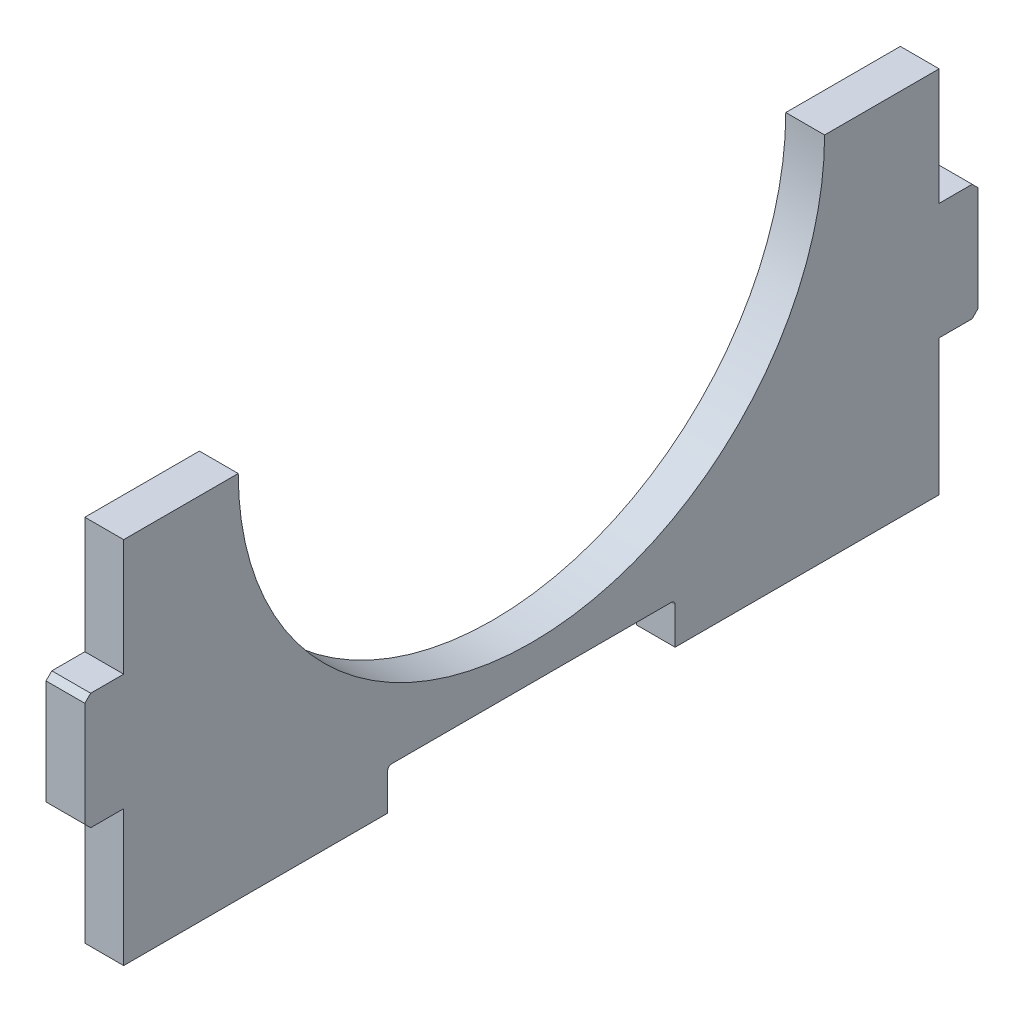
ISO-10303-21;
HEADER;
FILE_DESCRIPTION(('STEP AP214'),'2;1');
FILE_NAME('part.step','',(''),(''),'','','');
FILE_SCHEMA(('AUTOMOTIVE_DESIGN { 1 0 10303 214 1 1 1 1 }'));
ENDSEC;
DATA;
#1=APPLICATION_CONTEXT('core data for automotive mechanical design processes');
#2=APPLICATION_PROTOCOL_DEFINITION('international standard','automotive_design',2000,#1);
#3=PRODUCT_CONTEXT('',#1,'mechanical');
#4=PRODUCT('Part','Part','',(#3));
#5=PRODUCT_RELATED_PRODUCT_CATEGORY('part','',(#4));
#6=PRODUCT_DEFINITION_FORMATION('','',#4);
#7=PRODUCT_DEFINITION_CONTEXT('part definition',#1,'design');
#8=PRODUCT_DEFINITION('design','',#6,#7);
#9=PRODUCT_DEFINITION_SHAPE('','',#8);
#10=(LENGTH_UNIT() NAMED_UNIT(*) SI_UNIT(.MILLI.,.METRE.));
#11=(NAMED_UNIT(*) PLANE_ANGLE_UNIT() SI_UNIT($,.RADIAN.));
#12=(NAMED_UNIT(*) SI_UNIT($,.STERADIAN.) SOLID_ANGLE_UNIT());
#13=UNCERTAINTY_MEASURE_WITH_UNIT(LENGTH_MEASURE(1.E-05),#10,'distance_accuracy_value','');
#14=(GEOMETRIC_REPRESENTATION_CONTEXT(3) GLOBAL_UNCERTAINTY_ASSIGNED_CONTEXT((#13)) GLOBAL_UNIT_ASSIGNED_CONTEXT((#10,
#11,#12)) REPRESENTATION_CONTEXT('',''));
#15=CARTESIAN_POINT('',(0.,0.,0.));
#16=DIRECTION('',(0.,0.,1.));
#17=DIRECTION('',(1.,0.,0.));
#18=AXIS2_PLACEMENT_3D('',#15,#16,#17);
#19=CARTESIAN_POINT('',(5.,-95.,-105.));
#20=DIRECTION('',(0.,1.,0.));
#21=DIRECTION('',(0.,0.,1.));
#22=AXIS2_PLACEMENT_3D('',#19,#20,#21);
#23=PLANE('',#22);
#24=DIRECTION('',(0.,0.,-1.));
#25=VECTOR('',#24,1.);
#26=CARTESIAN_POINT('',(5.,-95.,-105.));
#27=LINE('',#26,#25);
#28=CARTESIAN_POINT('',(5.,-95.,-37.));
#29=VERTEX_POINT('',#28);
#30=CARTESIAN_POINT('',(5.,-95.,-105.));
#31=VERTEX_POINT('',#30);
#32=EDGE_CURVE('E229',#29,#31,#27,.T.);
#33=ORIENTED_EDGE('',*,*,#32,.F.);
#34=DIRECTION('',(1.,0.,0.));
#35=VECTOR('',#34,1.);
#36=CARTESIAN_POINT('',(-5.,-95.,-37.));
#37=LINE('',#36,#35);
#38=CARTESIAN_POINT('',(-5.,-95.,-37.));
#39=VERTEX_POINT('',#38);
#40=EDGE_CURVE('E221',#39,#29,#37,.T.);
#41=ORIENTED_EDGE('',*,*,#40,.F.);
#42=DIRECTION('',(0.,0.,-1.));
#43=VECTOR('',#42,1.);
#44=CARTESIAN_POINT('',(-5.,-95.,-105.));
#45=LINE('',#44,#43);
#46=CARTESIAN_POINT('',(-5.,-95.,-105.));
#47=VERTEX_POINT('',#46);
#48=EDGE_CURVE('E251',#39,#47,#45,.T.);
#49=ORIENTED_EDGE('',*,*,#48,.T.);
#50=DIRECTION('',(-1.,0.,0.));
#51=VECTOR('',#50,1.);
#52=CARTESIAN_POINT('',(5.,-95.,-105.));
#53=LINE('',#52,#51);
#54=EDGE_CURVE('E265',#31,#47,#53,.T.);
#55=ORIENTED_EDGE('',*,*,#54,.F.);
#56=EDGE_LOOP('',(#33,#41,#49,#55));
#57=FACE_BOUND('',#56,.T.);
#58=ADVANCED_FACE('F41',(#57),#23,.F.);
#59=CARTESIAN_POINT('',(5.,0.,-105.));
#60=DIRECTION('',(0.,0.,1.));
#61=DIRECTION('',(1.,0.,0.));
#62=AXIS2_PLACEMENT_3D('',#59,#60,#61);
#63=PLANE('',#62);
#64=DIRECTION('',(-1.,0.,0.));
#65=VECTOR('',#64,1.);
#66=CARTESIAN_POINT('',(5.,-60.,-105.));
#67=LINE('',#66,#65);
#68=CARTESIAN_POINT('',(5.,-60.,-105.));
#69=VERTEX_POINT('',#68);
#70=CARTESIAN_POINT('',(-5.,-60.,-105.));
#71=VERTEX_POINT('',#70);
#72=EDGE_CURVE('E362',#69,#71,#67,.T.);
#73=ORIENTED_EDGE('',*,*,#72,.F.);
#74=DIRECTION('',(0.,1.,0.));
#75=VECTOR('',#74,1.);
#76=CARTESIAN_POINT('',(5.,0.,-105.));
#77=LINE('',#76,#75);
#78=EDGE_CURVE('E231',#31,#69,#77,.T.);
#79=ORIENTED_EDGE('',*,*,#78,.F.);
#80=ORIENTED_EDGE('',*,*,#54,.T.);
#81=DIRECTION('',(0.,1.,0.));
#82=VECTOR('',#81,1.);
#83=CARTESIAN_POINT('',(-5.,0.,-105.));
#84=LINE('',#83,#82);
#85=EDGE_CURVE('E254',#47,#71,#84,.T.);
#86=ORIENTED_EDGE('',*,*,#85,.T.);
#87=EDGE_LOOP('',(#73,#79,#80,#86));
#88=FACE_BOUND('',#87,.T.);
#89=ADVANCED_FACE('F461',(#88),#63,.F.);
#90=CARTESIAN_POINT('',(5.,-95.,105.));
#91=DIRECTION('',(0.,0.,-1.));
#92=DIRECTION('',(-1.,0.,0.));
#93=AXIS2_PLACEMENT_3D('',#90,#91,#92);
#94=PLANE('',#93);
#95=DIRECTION('',(-1.,0.,0.));
#96=VECTOR('',#95,1.);
#97=CARTESIAN_POINT('',(5.,-30.,105.));
#98=LINE('',#97,#96);
#99=CARTESIAN_POINT('',(5.,-30.,105.));
#100=VERTEX_POINT('',#99);
#101=CARTESIAN_POINT('',(-5.,-30.,105.));
#102=VERTEX_POINT('',#101);
#103=EDGE_CURVE('E245',#100,#102,#98,.T.);
#104=ORIENTED_EDGE('',*,*,#103,.F.);
#105=DIRECTION('',(0.,-1.,0.));
#106=VECTOR('',#105,1.);
#107=CARTESIAN_POINT('',(5.,-95.,105.));
#108=LINE('',#107,#106);
#109=CARTESIAN_POINT('',(5.,0.,105.));
#110=VERTEX_POINT('',#109);
#111=EDGE_CURVE('E233',#110,#100,#108,.T.);
#112=ORIENTED_EDGE('',*,*,#111,.F.);
#113=DIRECTION('',(-1.,0.,0.));
#114=VECTOR('',#113,1.);
#115=CARTESIAN_POINT('',(5.,0.,105.));
#116=LINE('',#115,#114);
#117=CARTESIAN_POINT('',(-5.,0.,105.));
#118=VERTEX_POINT('',#117);
#119=EDGE_CURVE('E270',#110,#118,#116,.T.);
#120=ORIENTED_EDGE('',*,*,#119,.T.);
#121=DIRECTION('',(0.,-1.,0.));
#122=VECTOR('',#121,1.);
#123=CARTESIAN_POINT('',(-5.,-95.,105.));
#124=LINE('',#123,#122);
#125=EDGE_CURVE('E248',#118,#102,#124,.T.);
#126=ORIENTED_EDGE('',*,*,#125,.T.);
#127=EDGE_LOOP('',(#104,#112,#120,#126));
#128=FACE_BOUND('',#127,.T.);
#129=ADVANCED_FACE('F394',(#128),#94,.F.);
#130=CARTESIAN_POINT('',(5.,0.,0.));
#131=DIRECTION('',(-1.,0.,0.));
#132=DIRECTION('',(0.,0.,1.));
#133=AXIS2_PLACEMENT_3D('',#130,#131,#132);
#134=CYLINDRICAL_SURFACE('',#133,75.5);
#135=CARTESIAN_POINT('',(-5.,0.,0.));
#136=DIRECTION('',(-1.,0.,0.));
#137=DIRECTION('',(0.,0.,1.));
#138=AXIS2_PLACEMENT_3D('',#135,#136,#137);
#139=CIRCLE('',#138,75.5);
#140=CARTESIAN_POINT('',(-5.,0.,-75.5));
#141=VERTEX_POINT('',#140);
#142=CARTESIAN_POINT('',(-5.,0.,75.5));
#143=VERTEX_POINT('',#142);
#144=EDGE_CURVE('E241',#141,#143,#139,.T.);
#145=ORIENTED_EDGE('',*,*,#144,.T.);
#146=DIRECTION('',(-1.,0.,0.));
#147=VECTOR('',#146,1.);
#148=CARTESIAN_POINT('',(5.,0.,75.5));
#149=LINE('',#148,#147);
#150=CARTESIAN_POINT('',(5.,0.,75.5));
#151=VERTEX_POINT('',#150);
#152=EDGE_CURVE('E273',#151,#143,#149,.T.);
#153=ORIENTED_EDGE('',*,*,#152,.F.);
#154=CARTESIAN_POINT('',(5.,0.,0.));
#155=DIRECTION('',(-1.,0.,0.));
#156=DIRECTION('',(0.,0.,1.));
#157=AXIS2_PLACEMENT_3D('',#154,#155,#156);
#158=CIRCLE('',#157,75.5);
#159=CARTESIAN_POINT('',(5.,0.,-75.5));
#160=VERTEX_POINT('',#159);
#161=EDGE_CURVE('E259',#160,#151,#158,.T.);
#162=ORIENTED_EDGE('',*,*,#161,.F.);
#163=DIRECTION('',(-1.,0.,0.));
#164=VECTOR('',#163,1.);
#165=CARTESIAN_POINT('',(5.,0.,-75.5));
#166=LINE('',#165,#164);
#167=EDGE_CURVE('E240',#160,#141,#166,.T.);
#168=ORIENTED_EDGE('',*,*,#167,.T.);
#169=EDGE_LOOP('',(#145,#153,#162,#168));
#170=FACE_BOUND('',#169,.T.);
#171=ADVANCED_FACE('F426',(#170),#134,.F.);
#172=CARTESIAN_POINT('',(5.,0.,105.));
#173=DIRECTION('',(0.,-1.,0.));
#174=DIRECTION('',(0.,0.,-1.));
#175=AXIS2_PLACEMENT_3D('',#172,#173,#174);
#176=PLANE('',#175);
#177=DIRECTION('',(0.,0.,1.));
#178=VECTOR('',#177,1.);
#179=CARTESIAN_POINT('',(-5.,0.,105.));
#180=LINE('',#179,#178);
#181=EDGE_CURVE('E244',#143,#118,#180,.T.);
#182=ORIENTED_EDGE('',*,*,#181,.T.);
#183=ORIENTED_EDGE('',*,*,#119,.F.);
#184=DIRECTION('',(0.,0.,1.));
#185=VECTOR('',#184,1.);
#186=CARTESIAN_POINT('',(5.,0.,105.));
#187=LINE('',#186,#185);
#188=EDGE_CURVE('E387',#151,#110,#187,.T.);
#189=ORIENTED_EDGE('',*,*,#188,.F.);
#190=ORIENTED_EDGE('',*,*,#152,.T.);
#191=EDGE_LOOP('',(#182,#183,#189,#190));
#192=FACE_BOUND('',#191,.T.);
#193=ADVANCED_FACE('F423',(#192),#176,.F.);
#194=CARTESIAN_POINT('',(5.,-60.,105.));
#195=VERTEX_POINT('',#194);
#196=CARTESIAN_POINT('',(5.,-95.,105.));
#197=VERTEX_POINT('',#196);
#198=EDGE_CURVE('E226',#195,#197,#108,.T.);
#199=ORIENTED_EDGE('',*,*,#198,.F.);
#200=DIRECTION('',(-1.,0.,0.));
#201=VECTOR('',#200,1.);
#202=CARTESIAN_POINT('',(5.,-60.,105.));
#203=LINE('',#202,#201);
#204=CARTESIAN_POINT('',(-5.,-60.,105.));
#205=VERTEX_POINT('',#204);
#206=EDGE_CURVE('E375',#195,#205,#203,.T.);
#207=ORIENTED_EDGE('',*,*,#206,.T.);
#208=CARTESIAN_POINT('',(-5.,-95.,105.));
#209=VERTEX_POINT('',#208);
#210=EDGE_CURVE('E247',#205,#209,#124,.T.);
#211=ORIENTED_EDGE('',*,*,#210,.T.);
#212=DIRECTION('',(-1.,0.,0.));
#213=VECTOR('',#212,1.);
#214=CARTESIAN_POINT('',(5.,-95.,105.));
#215=LINE('',#214,#213);
#216=EDGE_CURVE('E268',#197,#209,#215,.T.);
#217=ORIENTED_EDGE('',*,*,#216,.F.);
#218=EDGE_LOOP('',(#199,#207,#211,#217));
#219=FACE_BOUND('',#218,.T.);
#220=ADVANCED_FACE('F418',(#219),#94,.F.);
#221=CARTESIAN_POINT('',(-5.,-95.,37.));
#222=VERTEX_POINT('',#221);
#223=EDGE_CURVE('E220',#209,#222,#45,.T.);
#224=ORIENTED_EDGE('',*,*,#223,.T.);
#225=DIRECTION('',(1.,0.,0.));
#226=VECTOR('',#225,1.);
#227=CARTESIAN_POINT('',(-5.,-95.,37.));
#228=LINE('',#227,#226);
#229=CARTESIAN_POINT('',(5.,-95.,37.));
#230=VERTEX_POINT('',#229);
#231=EDGE_CURVE('E206',#222,#230,#228,.T.);
#232=ORIENTED_EDGE('',*,*,#231,.T.);
#233=EDGE_CURVE('E218',#197,#230,#27,.T.);
#234=ORIENTED_EDGE('',*,*,#233,.F.);
#235=ORIENTED_EDGE('',*,*,#216,.T.);
#236=EDGE_LOOP('',(#224,#232,#234,#235));
#237=FACE_BOUND('',#236,.T.);
#238=ADVANCED_FACE('F216',(#237),#23,.F.);
#239=CARTESIAN_POINT('',(5.,-30.,-105.));
#240=VERTEX_POINT('',#239);
#241=CARTESIAN_POINT('',(5.,0.,-105.));
#242=VERTEX_POINT('',#241);
#243=EDGE_CURVE('E228',#240,#242,#77,.T.);
#244=ORIENTED_EDGE('',*,*,#243,.F.);
#245=DIRECTION('',(-1.,0.,0.));
#246=VECTOR('',#245,1.);
#247=CARTESIAN_POINT('',(5.,-30.,-105.));
#248=LINE('',#247,#246);
#249=CARTESIAN_POINT('',(-5.,-30.,-105.));
#250=VERTEX_POINT('',#249);
#251=EDGE_CURVE('E353',#240,#250,#248,.T.);
#252=ORIENTED_EDGE('',*,*,#251,.T.);
#253=CARTESIAN_POINT('',(-5.,0.,-105.));
#254=VERTEX_POINT('',#253);
#255=EDGE_CURVE('E253',#250,#254,#84,.T.);
#256=ORIENTED_EDGE('',*,*,#255,.T.);
#257=DIRECTION('',(-1.,0.,0.));
#258=VECTOR('',#257,1.);
#259=CARTESIAN_POINT('',(5.,0.,-105.));
#260=LINE('',#259,#258);
#261=EDGE_CURVE('E262',#242,#254,#260,.T.);
#262=ORIENTED_EDGE('',*,*,#261,.F.);
#263=EDGE_LOOP('',(#244,#252,#256,#262));
#264=FACE_BOUND('',#263,.T.);
#265=ADVANCED_FACE('F435',(#264),#63,.F.);
#266=CARTESIAN_POINT('',(5.,0.,-75.5));
#267=DIRECTION('',(0.,-1.,0.));
#268=DIRECTION('',(0.,0.,-1.));
#269=AXIS2_PLACEMENT_3D('',#266,#267,#268);
#270=PLANE('',#269);
#271=DIRECTION('',(0.,0.,1.));
#272=VECTOR('',#271,1.);
#273=CARTESIAN_POINT('',(-5.,0.,-75.5));
#274=LINE('',#273,#272);
#275=EDGE_CURVE('E257',#254,#141,#274,.T.);
#276=ORIENTED_EDGE('',*,*,#275,.T.);
#277=ORIENTED_EDGE('',*,*,#167,.F.);
#278=DIRECTION('',(0.,0.,1.));
#279=VECTOR('',#278,1.);
#280=CARTESIAN_POINT('',(5.,0.,-75.5));
#281=LINE('',#280,#279);
#282=EDGE_CURVE('E238',#242,#160,#281,.T.);
#283=ORIENTED_EDGE('',*,*,#282,.F.);
#284=ORIENTED_EDGE('',*,*,#261,.T.);
#285=EDGE_LOOP('',(#276,#277,#283,#284));
#286=FACE_BOUND('',#285,.T.);
#287=ADVANCED_FACE('F430',(#286),#270,.F.);
#288=CARTESIAN_POINT('',(5.,0.,0.));
#289=DIRECTION('',(-1.,0.,0.));
#290=DIRECTION('',(0.,0.,1.));
#291=AXIS2_PLACEMENT_3D('',#288,#289,#290);
#292=PLANE('',#291);
#293=DIRECTION('',(0.,0.,1.));
#294=VECTOR('',#293,1.);
#295=CARTESIAN_POINT('',(5.,-84.5,37.));
#296=LINE('',#295,#294);
#297=CARTESIAN_POINT('',(5.,-84.5,-36.));
#298=VERTEX_POINT('',#297);
#299=CARTESIAN_POINT('',(5.,-84.5,36.));
#300=VERTEX_POINT('',#299);
#301=EDGE_CURVE('E212',#298,#300,#296,.T.);
#302=ORIENTED_EDGE('',*,*,#301,.F.);
#303=CARTESIAN_POINT('',(5.,-85.5,-36.));
#304=DIRECTION('',(-1.,0.,0.));
#305=DIRECTION('',(0.,0.,1.));
#306=AXIS2_PLACEMENT_3D('',#303,#304,#305);
#307=CIRCLE('',#306,1.);
#308=CARTESIAN_POINT('',(5.,-85.5,-37.));
#309=VERTEX_POINT('',#308);
#310=EDGE_CURVE('E49',#298,#309,#307,.T.);
#311=ORIENTED_EDGE('',*,*,#310,.T.);
#312=DIRECTION('',(0.,1.,0.));
#313=VECTOR('',#312,1.);
#314=CARTESIAN_POINT('',(5.,-84.5,-37.));
#315=LINE('',#314,#313);
#316=EDGE_CURVE('E336',#29,#309,#315,.T.);
#317=ORIENTED_EDGE('',*,*,#316,.F.);
#318=ORIENTED_EDGE('',*,*,#32,.T.);
#319=ORIENTED_EDGE('',*,*,#78,.T.);
#320=DIRECTION('',(0.,0.,1.));
#321=VECTOR('',#320,1.);
#322=CARTESIAN_POINT('',(5.,-60.,-105.));
#323=LINE('',#322,#321);
#324=CARTESIAN_POINT('',(5.,-60.,-113.5));
#325=VERTEX_POINT('',#324);
#326=EDGE_CURVE('E344',#325,#69,#323,.T.);
#327=ORIENTED_EDGE('',*,*,#326,.F.);
#328=DIRECTION('',(0.,-0.707106781186548,0.707106781186548));
#329=VECTOR('',#328,1.);
#330=CARTESIAN_POINT('',(5.,-58.5,-115.));
#331=LINE('',#330,#329);
#332=CARTESIAN_POINT('',(5.,-58.5,-115.));
#333=VERTEX_POINT('',#332);
#334=EDGE_CURVE('E306',#325,#333,#331,.F.);
#335=ORIENTED_EDGE('',*,*,#334,.T.);
#336=DIRECTION('',(0.,-1.,0.));
#337=VECTOR('',#336,1.);
#338=CARTESIAN_POINT('',(5.,-60.,-115.));
#339=LINE('',#338,#337);
#340=CARTESIAN_POINT('',(5.,-31.5,-115.));
#341=VERTEX_POINT('',#340);
#342=EDGE_CURVE('E346',#341,#333,#339,.T.);
#343=ORIENTED_EDGE('',*,*,#342,.F.);
#344=DIRECTION('',(0.,-0.707106781186548,-0.707106781186548));
#345=VECTOR('',#344,1.);
#346=CARTESIAN_POINT('',(5.,-30.,-113.5));
#347=LINE('',#346,#345);
#348=CARTESIAN_POINT('',(5.,-30.,-113.5));
#349=VERTEX_POINT('',#348);
#350=EDGE_CURVE('E308',#341,#349,#347,.F.);
#351=ORIENTED_EDGE('',*,*,#350,.T.);
#352=DIRECTION('',(0.,0.,-1.));
#353=VECTOR('',#352,1.);
#354=CARTESIAN_POINT('',(5.,-30.,-115.));
#355=LINE('',#354,#353);
#356=EDGE_CURVE('E350',#240,#349,#355,.T.);
#357=ORIENTED_EDGE('',*,*,#356,.F.);
#358=ORIENTED_EDGE('',*,*,#243,.T.);
#359=ORIENTED_EDGE('',*,*,#282,.T.);
#360=ORIENTED_EDGE('',*,*,#161,.T.);
#361=ORIENTED_EDGE('',*,*,#188,.T.);
#362=ORIENTED_EDGE('',*,*,#111,.T.);
#363=DIRECTION('',(0.,0.,1.));
#364=VECTOR('',#363,1.);
#365=CARTESIAN_POINT('',(5.,-30.,115.));
#366=LINE('',#365,#364);
#367=CARTESIAN_POINT('',(5.,-30.,113.5));
#368=VERTEX_POINT('',#367);
#369=EDGE_CURVE('E366',#100,#368,#366,.T.);
#370=ORIENTED_EDGE('',*,*,#369,.T.);
#371=DIRECTION('',(0.,0.707106781186548,-0.707106781186548));
#372=VECTOR('',#371,1.);
#373=CARTESIAN_POINT('',(5.,-31.5,115.));
#374=LINE('',#373,#372);
#375=CARTESIAN_POINT('',(5.,-31.5,115.));
#376=VERTEX_POINT('',#375);
#377=EDGE_CURVE('E289',#368,#376,#374,.F.);
#378=ORIENTED_EDGE('',*,*,#377,.T.);
#379=DIRECTION('',(0.,-1.,0.));
#380=VECTOR('',#379,1.);
#381=CARTESIAN_POINT('',(5.,-60.,115.));
#382=LINE('',#381,#380);
#383=CARTESIAN_POINT('',(5.,-58.5,115.));
#384=VERTEX_POINT('',#383);
#385=EDGE_CURVE('E369',#376,#384,#382,.T.);
#386=ORIENTED_EDGE('',*,*,#385,.T.);
#387=DIRECTION('',(0.,0.707106781186548,0.707106781186548));
#388=VECTOR('',#387,1.);
#389=CARTESIAN_POINT('',(5.,-60.,113.5));
#390=LINE('',#389,#388);
#391=CARTESIAN_POINT('',(5.,-60.,113.5));
#392=VERTEX_POINT('',#391);
#393=EDGE_CURVE('E287',#384,#392,#390,.F.);
#394=ORIENTED_EDGE('',*,*,#393,.T.);
#395=DIRECTION('',(0.,0.,-1.));
#396=VECTOR('',#395,1.);
#397=CARTESIAN_POINT('',(5.,-60.,105.));
#398=LINE('',#397,#396);
#399=EDGE_CURVE('E373',#392,#195,#398,.T.);
#400=ORIENTED_EDGE('',*,*,#399,.T.);
#401=ORIENTED_EDGE('',*,*,#198,.T.);
#402=ORIENTED_EDGE('',*,*,#233,.T.);
#403=DIRECTION('',(0.,-1.,0.));
#404=VECTOR('',#403,1.);
#405=CARTESIAN_POINT('',(5.,-95.,37.));
#406=LINE('',#405,#404);
#407=CARTESIAN_POINT('',(5.,-85.5,37.));
#408=VERTEX_POINT('',#407);
#409=EDGE_CURVE('E202',#408,#230,#406,.T.);
#410=ORIENTED_EDGE('',*,*,#409,.F.);
#411=CARTESIAN_POINT('',(5.,-85.5,36.));
#412=DIRECTION('',(-1.,0.,0.));
#413=DIRECTION('',(0.,0.,1.));
#414=AXIS2_PLACEMENT_3D('',#411,#412,#413);
#415=CIRCLE('',#414,1.);
#416=EDGE_CURVE('E319',#408,#300,#415,.T.);
#417=ORIENTED_EDGE('',*,*,#416,.T.);
#418=EDGE_LOOP('',(#302,#311,#317,#318,#319,#327,#335,#343,#351,#357,#358,#359,#360,#361,#362,
#370,#378,#386,#394,#400,#401,#402,#410,#417));
#419=FACE_BOUND('',#418,.T.);
#420=ADVANCED_FACE('F224',(#419),#292,.F.);
#421=CARTESIAN_POINT('',(-5.,0.,0.));
#422=DIRECTION('',(-1.,0.,0.));
#423=DIRECTION('',(0.,0.,1.));
#424=AXIS2_PLACEMENT_3D('',#421,#422,#423);
#425=PLANE('',#424);
#426=DIRECTION('',(0.,1.,0.));
#427=VECTOR('',#426,1.);
#428=CARTESIAN_POINT('',(-5.,-84.5,-37.));
#429=LINE('',#428,#427);
#430=CARTESIAN_POINT('',(-5.,-85.5,-37.));
#431=VERTEX_POINT('',#430);
#432=EDGE_CURVE('E211',#39,#431,#429,.T.);
#433=ORIENTED_EDGE('',*,*,#432,.T.);
#434=CARTESIAN_POINT('',(-5.,-85.5,-36.));
#435=DIRECTION('',(-1.,0.,0.));
#436=DIRECTION('',(0.,0.,1.));
#437=AXIS2_PLACEMENT_3D('',#434,#435,#436);
#438=CIRCLE('',#437,1.);
#439=CARTESIAN_POINT('',(-5.,-84.5,-36.));
#440=VERTEX_POINT('',#439);
#441=EDGE_CURVE('E11',#431,#440,#438,.F.);
#442=ORIENTED_EDGE('',*,*,#441,.T.);
#443=DIRECTION('',(0.,0.,1.));
#444=VECTOR('',#443,1.);
#445=CARTESIAN_POINT('',(-5.,-84.5,37.));
#446=LINE('',#445,#444);
#447=CARTESIAN_POINT('',(-5.,-84.5,36.));
#448=VERTEX_POINT('',#447);
#449=EDGE_CURVE('E327',#440,#448,#446,.T.);
#450=ORIENTED_EDGE('',*,*,#449,.T.);
#451=CARTESIAN_POINT('',(-5.,-85.5,36.));
#452=DIRECTION('',(-1.,0.,0.));
#453=DIRECTION('',(0.,0.,1.));
#454=AXIS2_PLACEMENT_3D('',#451,#452,#453);
#455=CIRCLE('',#454,1.);
#456=CARTESIAN_POINT('',(-5.,-85.5,37.));
#457=VERTEX_POINT('',#456);
#458=EDGE_CURVE('E321',#448,#457,#455,.F.);
#459=ORIENTED_EDGE('',*,*,#458,.T.);
#460=DIRECTION('',(0.,-1.,0.));
#461=VECTOR('',#460,1.);
#462=CARTESIAN_POINT('',(-5.,-95.,37.));
#463=LINE('',#462,#461);
#464=EDGE_CURVE('E222',#457,#222,#463,.T.);
#465=ORIENTED_EDGE('',*,*,#464,.T.);
#466=ORIENTED_EDGE('',*,*,#223,.F.);
#467=ORIENTED_EDGE('',*,*,#210,.F.);
#468=DIRECTION('',(0.,0.,-1.));
#469=VECTOR('',#468,1.);
#470=CARTESIAN_POINT('',(-5.,-60.,105.));
#471=LINE('',#470,#469);
#472=CARTESIAN_POINT('',(-5.,-60.,113.5));
#473=VERTEX_POINT('',#472);
#474=EDGE_CURVE('E370',#473,#205,#471,.T.);
#475=ORIENTED_EDGE('',*,*,#474,.F.);
#476=DIRECTION('',(0.,-0.707106781186548,-0.707106781186548));
#477=VECTOR('',#476,1.);
#478=CARTESIAN_POINT('',(-5.,-86.75,86.75));
#479=LINE('',#478,#477);
#480=CARTESIAN_POINT('',(-5.,-58.5,115.));
#481=VERTEX_POINT('',#480);
#482=EDGE_CURVE('E281',#473,#481,#479,.F.);
#483=ORIENTED_EDGE('',*,*,#482,.T.);
#484=DIRECTION('',(0.,-1.,0.));
#485=VECTOR('',#484,1.);
#486=CARTESIAN_POINT('',(-5.,-60.,115.));
#487=LINE('',#486,#485);
#488=CARTESIAN_POINT('',(-5.,-31.5,115.));
#489=VERTEX_POINT('',#488);
#490=EDGE_CURVE('E378',#489,#481,#487,.T.);
#491=ORIENTED_EDGE('',*,*,#490,.F.);
#492=DIRECTION('',(0.,-0.707106781186548,0.707106781186548));
#493=VECTOR('',#492,1.);
#494=CARTESIAN_POINT('',(-5.,41.75,41.75));
#495=LINE('',#494,#493);
#496=CARTESIAN_POINT('',(-5.,-30.,113.5));
#497=VERTEX_POINT('',#496);
#498=EDGE_CURVE('E283',#489,#497,#495,.F.);
#499=ORIENTED_EDGE('',*,*,#498,.T.);
#500=DIRECTION('',(0.,0.,1.));
#501=VECTOR('',#500,1.);
#502=CARTESIAN_POINT('',(-5.,-30.,115.));
#503=LINE('',#502,#501);
#504=EDGE_CURVE('E365',#102,#497,#503,.T.);
#505=ORIENTED_EDGE('',*,*,#504,.F.);
#506=ORIENTED_EDGE('',*,*,#125,.F.);
#507=ORIENTED_EDGE('',*,*,#181,.F.);
#508=ORIENTED_EDGE('',*,*,#144,.F.);
#509=ORIENTED_EDGE('',*,*,#275,.F.);
#510=ORIENTED_EDGE('',*,*,#255,.F.);
#511=DIRECTION('',(0.,0.,-1.));
#512=VECTOR('',#511,1.);
#513=CARTESIAN_POINT('',(-5.,-30.,-115.));
#514=LINE('',#513,#512);
#515=CARTESIAN_POINT('',(-5.,-30.,-113.5));
#516=VERTEX_POINT('',#515);
#517=EDGE_CURVE('E347',#250,#516,#514,.T.);
#518=ORIENTED_EDGE('',*,*,#517,.T.);
#519=DIRECTION('',(0.,0.707106781186548,0.707106781186548));
#520=VECTOR('',#519,1.);
#521=CARTESIAN_POINT('',(-5.,41.75,-41.75));
#522=LINE('',#521,#520);
#523=CARTESIAN_POINT('',(-5.,-31.5,-115.));
#524=VERTEX_POINT('',#523);
#525=EDGE_CURVE('E299',#516,#524,#522,.F.);
#526=ORIENTED_EDGE('',*,*,#525,.T.);
#527=DIRECTION('',(0.,-1.,0.));
#528=VECTOR('',#527,1.);
#529=CARTESIAN_POINT('',(-5.,-60.,-115.));
#530=LINE('',#529,#528);
#531=CARTESIAN_POINT('',(-5.,-58.5,-115.));
#532=VERTEX_POINT('',#531);
#533=EDGE_CURVE('E355',#524,#532,#530,.T.);
#534=ORIENTED_EDGE('',*,*,#533,.T.);
#535=DIRECTION('',(0.,0.707106781186548,-0.707106781186548));
#536=VECTOR('',#535,1.);
#537=CARTESIAN_POINT('',(-5.,-86.75,-86.75));
#538=LINE('',#537,#536);
#539=CARTESIAN_POINT('',(-5.,-60.,-113.5));
#540=VERTEX_POINT('',#539);
#541=EDGE_CURVE('E297',#532,#540,#538,.F.);
#542=ORIENTED_EDGE('',*,*,#541,.T.);
#543=DIRECTION('',(0.,0.,1.));
#544=VECTOR('',#543,1.);
#545=CARTESIAN_POINT('',(-5.,-60.,-105.));
#546=LINE('',#545,#544);
#547=EDGE_CURVE('E342',#540,#71,#546,.T.);
#548=ORIENTED_EDGE('',*,*,#547,.T.);
#549=ORIENTED_EDGE('',*,*,#85,.F.);
#550=ORIENTED_EDGE('',*,*,#48,.F.);
#551=EDGE_LOOP('',(#433,#442,#450,#459,#465,#466,#467,#475,#483,#491,#499,#505,#506,#507,#508,
#509,#510,#518,#526,#534,#542,#548,#549,#550));
#552=FACE_BOUND('',#551,.T.);
#553=ADVANCED_FACE('F325',(#552),#425,.T.);
#554=CARTESIAN_POINT('',(5.,-30.,115.));
#555=DIRECTION('',(0.,-1.,0.));
#556=DIRECTION('',(0.,0.,-1.));
#557=AXIS2_PLACEMENT_3D('',#554,#555,#556);
#558=PLANE('',#557);
#559=ORIENTED_EDGE('',*,*,#504,.T.);
#560=DIRECTION('',(1.,0.,0.));
#561=VECTOR('',#560,1.);
#562=CARTESIAN_POINT('',(5.,-30.,113.5));
#563=LINE('',#562,#561);
#564=EDGE_CURVE('E285',#497,#368,#563,.T.);
#565=ORIENTED_EDGE('',*,*,#564,.T.);
#566=ORIENTED_EDGE('',*,*,#369,.F.);
#567=ORIENTED_EDGE('',*,*,#103,.T.);
#568=EDGE_LOOP('',(#559,#565,#566,#567));
#569=FACE_BOUND('',#568,.T.);
#570=ADVANCED_FACE('F397',(#569),#558,.F.);
#571=CARTESIAN_POINT('',(5.,-60.,115.));
#572=DIRECTION('',(0.,0.,-1.));
#573=DIRECTION('',(-1.,0.,0.));
#574=AXIS2_PLACEMENT_3D('',#571,#572,#573);
#575=PLANE('',#574);
#576=ORIENTED_EDGE('',*,*,#385,.F.);
#577=DIRECTION('',(-1.,0.,0.));
#578=VECTOR('',#577,1.);
#579=CARTESIAN_POINT('',(5.,-31.5,115.));
#580=LINE('',#579,#578);
#581=EDGE_CURVE('E278',#376,#489,#580,.T.);
#582=ORIENTED_EDGE('',*,*,#581,.T.);
#583=ORIENTED_EDGE('',*,*,#490,.T.);
#584=DIRECTION('',(1.,0.,0.));
#585=VECTOR('',#584,1.);
#586=CARTESIAN_POINT('',(5.,-58.5,115.));
#587=LINE('',#586,#585);
#588=EDGE_CURVE('E276',#481,#384,#587,.T.);
#589=ORIENTED_EDGE('',*,*,#588,.T.);
#590=EDGE_LOOP('',(#576,#582,#583,#589));
#591=FACE_BOUND('',#590,.T.);
#592=ADVANCED_FACE('F405',(#591),#575,.F.);
#593=CARTESIAN_POINT('',(5.,-60.,105.));
#594=DIRECTION('',(0.,1.,0.));
#595=DIRECTION('',(0.,0.,1.));
#596=AXIS2_PLACEMENT_3D('',#593,#594,#595);
#597=PLANE('',#596);
#598=ORIENTED_EDGE('',*,*,#399,.F.);
#599=DIRECTION('',(-1.,0.,0.));
#600=VECTOR('',#599,1.);
#601=CARTESIAN_POINT('',(5.,-60.,113.5));
#602=LINE('',#601,#600);
#603=EDGE_CURVE('E291',#392,#473,#602,.T.);
#604=ORIENTED_EDGE('',*,*,#603,.T.);
#605=ORIENTED_EDGE('',*,*,#474,.T.);
#606=ORIENTED_EDGE('',*,*,#206,.F.);
#607=EDGE_LOOP('',(#598,#604,#605,#606));
#608=FACE_BOUND('',#607,.T.);
#609=ADVANCED_FACE('F414',(#608),#597,.F.);
#610=CARTESIAN_POINT('',(5.,-31.5,115.));
#611=DIRECTION('',(0.,-0.707106781186547,-0.707106781186547));
#612=DIRECTION('',(-1.,0.,0.));
#613=AXIS2_PLACEMENT_3D('',#610,#611,#612);
#614=PLANE('',#613);
#615=ORIENTED_EDGE('',*,*,#377,.F.);
#616=ORIENTED_EDGE('',*,*,#564,.F.);
#617=ORIENTED_EDGE('',*,*,#498,.F.);
#618=ORIENTED_EDGE('',*,*,#581,.F.);
#619=EDGE_LOOP('',(#615,#616,#617,#618));
#620=FACE_BOUND('',#619,.T.);
#621=ADVANCED_FACE('F400',(#620),#614,.F.);
#622=CARTESIAN_POINT('',(5.,-60.,113.5));
#623=DIRECTION('',(0.,0.707106781186548,-0.707106781186548));
#624=DIRECTION('',(-1.,0.,0.));
#625=AXIS2_PLACEMENT_3D('',#622,#623,#624);
#626=PLANE('',#625);
#627=ORIENTED_EDGE('',*,*,#393,.F.);
#628=ORIENTED_EDGE('',*,*,#588,.F.);
#629=ORIENTED_EDGE('',*,*,#482,.F.);
#630=ORIENTED_EDGE('',*,*,#603,.F.);
#631=EDGE_LOOP('',(#627,#628,#629,#630));
#632=FACE_BOUND('',#631,.T.);
#633=ADVANCED_FACE('F409',(#632),#626,.F.);
#634=CARTESIAN_POINT('',(5.,-60.,-105.));
#635=DIRECTION('',(0.,-1.,0.));
#636=DIRECTION('',(0.,0.,-1.));
#637=AXIS2_PLACEMENT_3D('',#634,#635,#636);
#638=PLANE('',#637);
#639=ORIENTED_EDGE('',*,*,#547,.F.);
#640=DIRECTION('',(1.,0.,0.));
#641=VECTOR('',#640,1.);
#642=CARTESIAN_POINT('',(5.,-60.,-113.5));
#643=LINE('',#642,#641);
#644=EDGE_CURVE('E310',#540,#325,#643,.T.);
#645=ORIENTED_EDGE('',*,*,#644,.T.);
#646=ORIENTED_EDGE('',*,*,#326,.T.);
#647=ORIENTED_EDGE('',*,*,#72,.T.);
#648=EDGE_LOOP('',(#639,#645,#646,#647));
#649=FACE_BOUND('',#648,.T.);
#650=ADVANCED_FACE('F456',(#649),#638,.T.);
#651=CARTESIAN_POINT('',(5.,-60.,-115.));
#652=DIRECTION('',(0.,0.,-1.));
#653=DIRECTION('',(-1.,0.,0.));
#654=AXIS2_PLACEMENT_3D('',#651,#652,#653);
#655=PLANE('',#654);
#656=ORIENTED_EDGE('',*,*,#533,.F.);
#657=DIRECTION('',(1.,0.,0.));
#658=VECTOR('',#657,1.);
#659=CARTESIAN_POINT('',(5.,-31.5,-115.));
#660=LINE('',#659,#658);
#661=EDGE_CURVE('E304',#524,#341,#660,.T.);
#662=ORIENTED_EDGE('',*,*,#661,.T.);
#663=ORIENTED_EDGE('',*,*,#342,.T.);
#664=DIRECTION('',(-1.,0.,0.));
#665=VECTOR('',#664,1.);
#666=CARTESIAN_POINT('',(5.,-58.5,-115.));
#667=LINE('',#666,#665);
#668=EDGE_CURVE('E301',#333,#532,#667,.T.);
#669=ORIENTED_EDGE('',*,*,#668,.T.);
#670=EDGE_LOOP('',(#656,#662,#663,#669));
#671=FACE_BOUND('',#670,.T.);
#672=ADVANCED_FACE('F447',(#671),#655,.T.);
#673=CARTESIAN_POINT('',(5.,-30.,-115.));
#674=DIRECTION('',(0.,1.,0.));
#675=DIRECTION('',(0.,0.,1.));
#676=AXIS2_PLACEMENT_3D('',#673,#674,#675);
#677=PLANE('',#676);
#678=ORIENTED_EDGE('',*,*,#356,.T.);
#679=DIRECTION('',(-1.,0.,0.));
#680=VECTOR('',#679,1.);
#681=CARTESIAN_POINT('',(5.,-30.,-113.5));
#682=LINE('',#681,#680);
#683=EDGE_CURVE('E294',#349,#516,#682,.T.);
#684=ORIENTED_EDGE('',*,*,#683,.T.);
#685=ORIENTED_EDGE('',*,*,#517,.F.);
#686=ORIENTED_EDGE('',*,*,#251,.F.);
#687=EDGE_LOOP('',(#678,#684,#685,#686));
#688=FACE_BOUND('',#687,.T.);
#689=ADVANCED_FACE('F438',(#688),#677,.T.);
#690=CARTESIAN_POINT('',(5.,-30.,-113.5));
#691=DIRECTION('',(0.,-0.707106781186547,0.707106781186547));
#692=DIRECTION('',(-1.,0.,0.));
#693=AXIS2_PLACEMENT_3D('',#690,#691,#692);
#694=PLANE('',#693);
#695=ORIENTED_EDGE('',*,*,#350,.F.);
#696=ORIENTED_EDGE('',*,*,#661,.F.);
#697=ORIENTED_EDGE('',*,*,#525,.F.);
#698=ORIENTED_EDGE('',*,*,#683,.F.);
#699=EDGE_LOOP('',(#695,#696,#697,#698));
#700=FACE_BOUND('',#699,.T.);
#701=ADVANCED_FACE('F444',(#700),#694,.F.);
#702=CARTESIAN_POINT('',(5.,-58.5,-115.));
#703=DIRECTION('',(0.,0.707106781186547,0.707106781186547));
#704=DIRECTION('',(-1.,0.,0.));
#705=AXIS2_PLACEMENT_3D('',#702,#703,#704);
#706=PLANE('',#705);
#707=ORIENTED_EDGE('',*,*,#334,.F.);
#708=ORIENTED_EDGE('',*,*,#644,.F.);
#709=ORIENTED_EDGE('',*,*,#541,.F.);
#710=ORIENTED_EDGE('',*,*,#668,.F.);
#711=EDGE_LOOP('',(#707,#708,#709,#710));
#712=FACE_BOUND('',#711,.T.);
#713=ADVANCED_FACE('F451',(#712),#706,.F.);
#714=CARTESIAN_POINT('',(-5.,-84.5,-37.));
#715=DIRECTION('',(0.,0.,-1.));
#716=DIRECTION('',(-1.,0.,0.));
#717=AXIS2_PLACEMENT_3D('',#714,#715,#716);
#718=PLANE('',#717);
#719=ORIENTED_EDGE('',*,*,#316,.T.);
#720=DIRECTION('',(1.,0.,0.));
#721=VECTOR('',#720,1.);
#722=CARTESIAN_POINT('',(-5.,-85.5,-37.));
#723=LINE('',#722,#721);
#724=EDGE_CURVE('E62',#309,#431,#723,.F.);
#725=ORIENTED_EDGE('',*,*,#724,.T.);
#726=ORIENTED_EDGE('',*,*,#432,.F.);
#727=ORIENTED_EDGE('',*,*,#40,.T.);
#728=EDGE_LOOP('',(#719,#725,#726,#727));
#729=FACE_BOUND('',#728,.T.);
#730=ADVANCED_FACE('F468',(#729),#718,.F.);
#731=CARTESIAN_POINT('',(-5.,-95.,37.));
#732=DIRECTION('',(0.,0.,1.));
#733=DIRECTION('',(1.,0.,0.));
#734=AXIS2_PLACEMENT_3D('',#731,#732,#733);
#735=PLANE('',#734);
#736=ORIENTED_EDGE('',*,*,#464,.F.);
#737=DIRECTION('',(1.,0.,0.));
#738=VECTOR('',#737,1.);
#739=CARTESIAN_POINT('',(5.,-85.5,37.));
#740=LINE('',#739,#738);
#741=EDGE_CURVE('E209',#457,#408,#740,.T.);
#742=ORIENTED_EDGE('',*,*,#741,.T.);
#743=ORIENTED_EDGE('',*,*,#409,.T.);
#744=ORIENTED_EDGE('',*,*,#231,.F.);
#745=EDGE_LOOP('',(#736,#742,#743,#744));
#746=FACE_BOUND('',#745,.T.);
#747=ADVANCED_FACE('F205',(#746),#735,.F.);
#748=CARTESIAN_POINT('',(-5.,-84.5,37.));
#749=DIRECTION('',(0.,1.,0.));
#750=DIRECTION('',(0.,0.,1.));
#751=AXIS2_PLACEMENT_3D('',#748,#749,#750);
#752=PLANE('',#751);
#753=ORIENTED_EDGE('',*,*,#301,.T.);
#754=DIRECTION('',(1.,0.,0.));
#755=VECTOR('',#754,1.);
#756=CARTESIAN_POINT('',(-5.,-84.5,36.));
#757=LINE('',#756,#755);
#758=EDGE_CURVE('E316',#300,#448,#757,.F.);
#759=ORIENTED_EDGE('',*,*,#758,.T.);
#760=ORIENTED_EDGE('',*,*,#449,.F.);
#761=DIRECTION('',(1.,0.,0.));
#762=VECTOR('',#761,1.);
#763=CARTESIAN_POINT('',(5.,-84.5,-36.));
#764=LINE('',#763,#762);
#765=EDGE_CURVE('E313',#440,#298,#764,.T.);
#766=ORIENTED_EDGE('',*,*,#765,.T.);
#767=EDGE_LOOP('',(#753,#759,#760,#766));
#768=FACE_BOUND('',#767,.T.);
#769=ADVANCED_FACE('F334',(#768),#752,.F.);
#770=CARTESIAN_POINT('',(-5.,-85.5,36.));
#771=DIRECTION('',(-1.,0.,0.));
#772=DIRECTION('',(0.,0.,1.));
#773=AXIS2_PLACEMENT_3D('',#770,#771,#772);
#774=CYLINDRICAL_SURFACE('',#773,1.);
#775=ORIENTED_EDGE('',*,*,#458,.F.);
#776=ORIENTED_EDGE('',*,*,#758,.F.);
#777=ORIENTED_EDGE('',*,*,#416,.F.);
#778=ORIENTED_EDGE('',*,*,#741,.F.);
#779=EDGE_LOOP('',(#775,#776,#777,#778));
#780=FACE_BOUND('',#779,.T.);
#781=ADVANCED_FACE('F331',(#780),#774,.F.);
#782=CARTESIAN_POINT('',(-5.,-85.5,-36.));
#783=DIRECTION('',(-1.,0.,0.));
#784=DIRECTION('',(0.,0.,1.));
#785=AXIS2_PLACEMENT_3D('',#782,#783,#784);
#786=CYLINDRICAL_SURFACE('',#785,1.);
#787=ORIENTED_EDGE('',*,*,#441,.F.);
#788=ORIENTED_EDGE('',*,*,#724,.F.);
#789=ORIENTED_EDGE('',*,*,#310,.F.);
#790=ORIENTED_EDGE('',*,*,#765,.F.);
#791=EDGE_LOOP('',(#787,#788,#789,#790));
#792=FACE_BOUND('',#791,.T.);
#793=ADVANCED_FACE('F43',(#792),#786,.F.);
#794=CLOSED_SHELL('',(#58,#89,#129,#171,#193,#220,#238,#265,#287,#420,#553,#570,#592,#609,#621,
#633,#650,#672,#689,#701,#713,#730,#747,#769,#781,#793));
#795=MANIFOLD_SOLID_BREP('B2',#794);
#796=ADVANCED_BREP_SHAPE_REPRESENTATION('',(#18,#795),#14);
#797=SHAPE_DEFINITION_REPRESENTATION(#9,#796);
ENDSEC;
END-ISO-10303-21;
